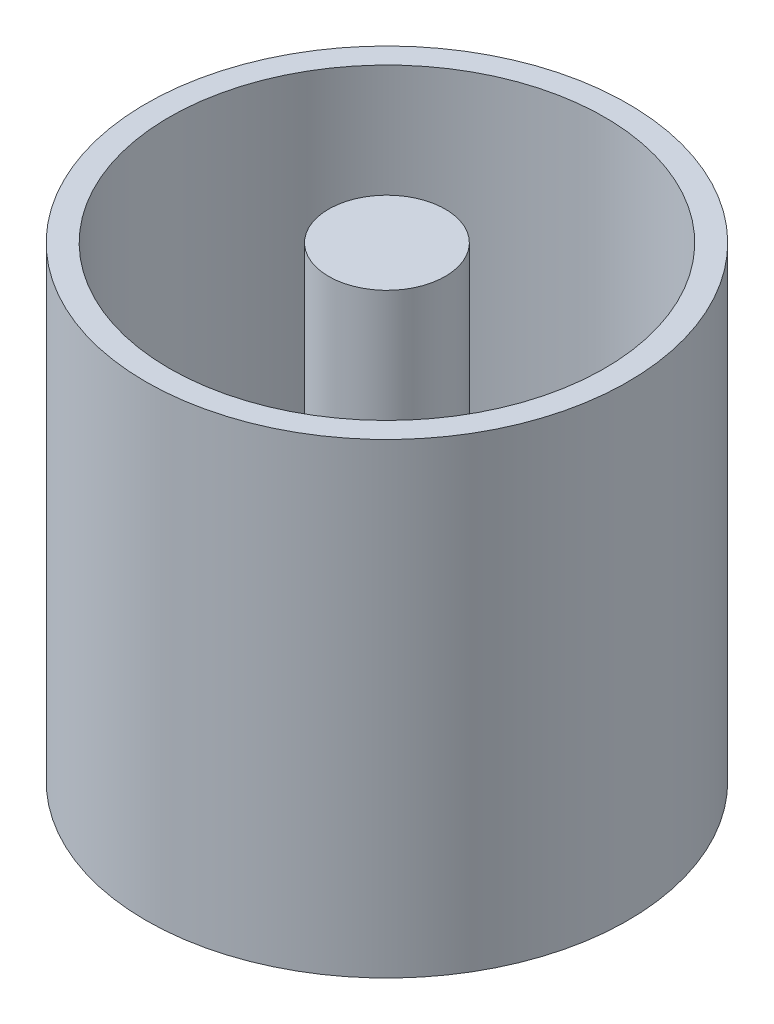
ISO-10303-21;
HEADER;
FILE_DESCRIPTION(('STEP AP214'),'2;1');
FILE_NAME('part.step','',(''),(''),'','','');
FILE_SCHEMA(('AUTOMOTIVE_DESIGN { 1 0 10303 214 1 1 1 1 }'));
ENDSEC;
DATA;
#1=APPLICATION_CONTEXT('core data for automotive mechanical design processes');
#2=APPLICATION_PROTOCOL_DEFINITION('international standard','automotive_design',2000,#1);
#3=PRODUCT_CONTEXT('',#1,'mechanical');
#4=PRODUCT('Part','Part','',(#3));
#5=PRODUCT_RELATED_PRODUCT_CATEGORY('part','',(#4));
#6=PRODUCT_DEFINITION_FORMATION('','',#4);
#7=PRODUCT_DEFINITION_CONTEXT('part definition',#1,'design');
#8=PRODUCT_DEFINITION('design','',#6,#7);
#9=PRODUCT_DEFINITION_SHAPE('','',#8);
#10=(LENGTH_UNIT() NAMED_UNIT(*) SI_UNIT(.MILLI.,.METRE.));
#11=(NAMED_UNIT(*) PLANE_ANGLE_UNIT() SI_UNIT($,.RADIAN.));
#12=(NAMED_UNIT(*) SI_UNIT($,.STERADIAN.) SOLID_ANGLE_UNIT());
#13=UNCERTAINTY_MEASURE_WITH_UNIT(LENGTH_MEASURE(1.E-05),#10,'distance_accuracy_value','');
#14=(GEOMETRIC_REPRESENTATION_CONTEXT(3) GLOBAL_UNCERTAINTY_ASSIGNED_CONTEXT((#13)) GLOBAL_UNIT_ASSIGNED_CONTEXT((#10,
#11,#12)) REPRESENTATION_CONTEXT('',''));
#15=CARTESIAN_POINT('',(0.,0.,0.));
#16=DIRECTION('',(0.,0.,1.));
#17=DIRECTION('',(1.,0.,0.));
#18=AXIS2_PLACEMENT_3D('',#15,#16,#17);
#19=CARTESIAN_POINT('',(0.,30.,0.));
#20=DIRECTION('',(0.,-1.,0.));
#21=DIRECTION('',(0.,0.,-1.));
#22=AXIS2_PLACEMENT_3D('',#19,#20,#21);
#23=CYLINDRICAL_SURFACE('',#22,15.5);
#24=CARTESIAN_POINT('',(0.,30.,0.));
#25=DIRECTION('',(0.,1.,0.));
#26=DIRECTION('',(0.,0.,1.));
#27=AXIS2_PLACEMENT_3D('',#24,#25,#26);
#28=CIRCLE('',#27,15.5);
#29=CARTESIAN_POINT('',(0.,30.,15.5));
#30=VERTEX_POINT('',#29);
#31=EDGE_CURVE('E10',#30,#30,#28,.T.);
#32=ORIENTED_EDGE('',*,*,#31,.F.);
#33=EDGE_LOOP('',(#32));
#34=FACE_BOUND('',#33,.T.);
#35=CARTESIAN_POINT('',(0.,0.,0.));
#36=DIRECTION('',(0.,1.,0.));
#37=DIRECTION('',(0.,0.,1.));
#38=AXIS2_PLACEMENT_3D('',#35,#36,#37);
#39=CIRCLE('',#38,15.5);
#40=CARTESIAN_POINT('',(0.,0.,15.5));
#41=VERTEX_POINT('',#40);
#42=EDGE_CURVE('E46',#41,#41,#39,.T.);
#43=ORIENTED_EDGE('',*,*,#42,.T.);
#44=EDGE_LOOP('',(#43));
#45=FACE_BOUND('',#44,.T.);
#46=ADVANCED_FACE('F39',(#34,#45),#23,.T.);
#47=CARTESIAN_POINT('',(0.,30.,0.));
#48=DIRECTION('',(0.,1.,0.));
#49=DIRECTION('',(0.,0.,1.));
#50=AXIS2_PLACEMENT_3D('',#47,#48,#49);
#51=PLANE('',#50);
#52=CARTESIAN_POINT('',(0.,30.,0.));
#53=DIRECTION('',(0.,1.,0.));
#54=DIRECTION('',(0.,0.,1.));
#55=AXIS2_PLACEMENT_3D('',#52,#53,#54);
#56=CIRCLE('',#55,14.);
#57=CARTESIAN_POINT('',(0.,30.,14.));
#58=VERTEX_POINT('',#57);
#59=EDGE_CURVE('E54',#58,#58,#56,.T.);
#60=ORIENTED_EDGE('',*,*,#59,.F.);
#61=EDGE_LOOP('',(#60));
#62=FACE_BOUND('',#61,.T.);
#63=ORIENTED_EDGE('',*,*,#31,.T.);
#64=EDGE_LOOP('',(#63));
#65=FACE_BOUND('',#64,.T.);
#66=ADVANCED_FACE('F81',(#62,#65),#51,.T.);
#67=CARTESIAN_POINT('',(0.,0.,0.));
#68=DIRECTION('',(0.,1.,0.));
#69=DIRECTION('',(0.,0.,1.));
#70=AXIS2_PLACEMENT_3D('',#67,#68,#69);
#71=PLANE('',#70);
#72=CARTESIAN_POINT('',(-9.,0.,0.));
#73=DIRECTION('',(0.,-1.,0.));
#74=DIRECTION('',(0.,0.,-1.));
#75=AXIS2_PLACEMENT_3D('',#72,#73,#74);
#76=CIRCLE('',#75,1.);
#77=CARTESIAN_POINT('',(-9.,0.,-1.));
#78=VERTEX_POINT('',#77);
#79=EDGE_CURVE('E58',#78,#78,#76,.T.);
#80=ORIENTED_EDGE('',*,*,#79,.F.);
#81=EDGE_LOOP('',(#80));
#82=FACE_BOUND('',#81,.T.);
#83=CARTESIAN_POINT('',(-12.5,0.,0.));
#84=DIRECTION('',(0.,-1.,0.));
#85=DIRECTION('',(0.,0.,-1.));
#86=AXIS2_PLACEMENT_3D('',#83,#84,#85);
#87=CIRCLE('',#86,0.999999999999998);
#88=CARTESIAN_POINT('',(-12.5,0.,-0.999999999999998));
#89=VERTEX_POINT('',#88);
#90=EDGE_CURVE('E63',#89,#89,#87,.T.);
#91=ORIENTED_EDGE('',*,*,#90,.F.);
#92=EDGE_LOOP('',(#91));
#93=FACE_BOUND('',#92,.T.);
#94=ORIENTED_EDGE('',*,*,#42,.F.);
#95=EDGE_LOOP('',(#94));
#96=FACE_BOUND('',#95,.T.);
#97=ADVANCED_FACE('F83',(#82,#93,#96),#71,.F.);
#98=CARTESIAN_POINT('',(0.,3.,0.));
#99=DIRECTION('',(0.,1.,0.));
#100=DIRECTION('',(0.,0.,1.));
#101=AXIS2_PLACEMENT_3D('',#98,#99,#100);
#102=CYLINDRICAL_SURFACE('',#101,14.);
#103=CARTESIAN_POINT('',(0.,3.,0.));
#104=DIRECTION('',(0.,1.,0.));
#105=DIRECTION('',(0.,0.,1.));
#106=AXIS2_PLACEMENT_3D('',#103,#104,#105);
#107=CIRCLE('',#106,14.);
#108=CARTESIAN_POINT('',(0.,3.,14.));
#109=VERTEX_POINT('',#108);
#110=EDGE_CURVE('E51',#109,#109,#107,.T.);
#111=ORIENTED_EDGE('',*,*,#110,.F.);
#112=EDGE_LOOP('',(#111));
#113=FACE_BOUND('',#112,.T.);
#114=ORIENTED_EDGE('',*,*,#59,.T.);
#115=EDGE_LOOP('',(#114));
#116=FACE_BOUND('',#115,.T.);
#117=ADVANCED_FACE('F79',(#113,#116),#102,.F.);
#118=CARTESIAN_POINT('',(0.,3.,0.));
#119=DIRECTION('',(0.,1.,0.));
#120=DIRECTION('',(0.,0.,1.));
#121=AXIS2_PLACEMENT_3D('',#118,#119,#120);
#122=PLANE('',#121);
#123=CARTESIAN_POINT('',(0.,3.,0.));
#124=DIRECTION('',(0.,1.,0.));
#125=DIRECTION('',(0.,0.,1.));
#126=AXIS2_PLACEMENT_3D('',#123,#124,#125);
#127=CIRCLE('',#126,3.75);
#128=CARTESIAN_POINT('',(0.,3.,3.75));
#129=VERTEX_POINT('',#128);
#130=EDGE_CURVE('E71',#129,#129,#127,.T.);
#131=ORIENTED_EDGE('',*,*,#130,.F.);
#132=EDGE_LOOP('',(#131));
#133=FACE_BOUND('',#132,.T.);
#134=CARTESIAN_POINT('',(-9.,3.,0.));
#135=DIRECTION('',(0.,1.,0.));
#136=DIRECTION('',(0.,0.,1.));
#137=AXIS2_PLACEMENT_3D('',#134,#135,#136);
#138=CIRCLE('',#137,1.);
#139=CARTESIAN_POINT('',(-9.,3.,1.));
#140=VERTEX_POINT('',#139);
#141=EDGE_CURVE('E42',#140,#140,#138,.T.);
#142=ORIENTED_EDGE('',*,*,#141,.F.);
#143=EDGE_LOOP('',(#142));
#144=FACE_BOUND('',#143,.T.);
#145=CARTESIAN_POINT('',(-12.5,3.,0.));
#146=DIRECTION('',(0.,1.,0.));
#147=DIRECTION('',(0.,0.,1.));
#148=AXIS2_PLACEMENT_3D('',#145,#146,#147);
#149=CIRCLE('',#148,0.999999999999998);
#150=CARTESIAN_POINT('',(-12.5,3.,0.999999999999998));
#151=VERTEX_POINT('',#150);
#152=EDGE_CURVE('E56',#151,#151,#149,.T.);
#153=ORIENTED_EDGE('',*,*,#152,.F.);
#154=EDGE_LOOP('',(#153));
#155=FACE_BOUND('',#154,.T.);
#156=ORIENTED_EDGE('',*,*,#110,.T.);
#157=EDGE_LOOP('',(#156));
#158=FACE_BOUND('',#157,.T.);
#159=ADVANCED_FACE('F94',(#133,#144,#155,#158),#122,.T.);
#160=CARTESIAN_POINT('',(-12.5,10.,0.));
#161=DIRECTION('',(0.,-1.,0.));
#162=DIRECTION('',(0.,0.,-1.));
#163=AXIS2_PLACEMENT_3D('',#160,#161,#162);
#164=CYLINDRICAL_SURFACE('',#163,0.999999999999998);
#165=ORIENTED_EDGE('',*,*,#152,.T.);
#166=EDGE_LOOP('',(#165));
#167=FACE_BOUND('',#166,.T.);
#168=ORIENTED_EDGE('',*,*,#90,.T.);
#169=EDGE_LOOP('',(#168));
#170=FACE_BOUND('',#169,.T.);
#171=ADVANCED_FACE('F98',(#167,#170),#164,.F.);
#172=CARTESIAN_POINT('',(-9.,10.,0.));
#173=DIRECTION('',(0.,-1.,0.));
#174=DIRECTION('',(0.,0.,-1.));
#175=AXIS2_PLACEMENT_3D('',#172,#173,#174);
#176=CYLINDRICAL_SURFACE('',#175,1.);
#177=ORIENTED_EDGE('',*,*,#141,.T.);
#178=EDGE_LOOP('',(#177));
#179=FACE_BOUND('',#178,.T.);
#180=ORIENTED_EDGE('',*,*,#79,.T.);
#181=EDGE_LOOP('',(#180));
#182=FACE_BOUND('',#181,.T.);
#183=ADVANCED_FACE('F102',(#179,#182),#176,.F.);
#184=CARTESIAN_POINT('',(0.,30.,0.));
#185=DIRECTION('',(0.,-1.,0.));
#186=DIRECTION('',(0.,0.,-1.));
#187=AXIS2_PLACEMENT_3D('',#184,#185,#186);
#188=CYLINDRICAL_SURFACE('',#187,3.75);
#189=CARTESIAN_POINT('',(0.,30.,0.));
#190=DIRECTION('',(0.,1.,0.));
#191=DIRECTION('',(0.,0.,1.));
#192=AXIS2_PLACEMENT_3D('',#189,#190,#191);
#193=CIRCLE('',#192,3.75);
#194=CARTESIAN_POINT('',(0.,30.,3.75));
#195=VERTEX_POINT('',#194);
#196=EDGE_CURVE('E68',#195,#195,#193,.T.);
#197=ORIENTED_EDGE('',*,*,#196,.F.);
#198=EDGE_LOOP('',(#197));
#199=FACE_BOUND('',#198,.T.);
#200=ORIENTED_EDGE('',*,*,#130,.T.);
#201=EDGE_LOOP('',(#200));
#202=FACE_BOUND('',#201,.T.);
#203=ADVANCED_FACE('F105',(#199,#202),#188,.T.);
#204=CARTESIAN_POINT('',(0.,30.,0.));
#205=DIRECTION('',(0.,1.,0.));
#206=DIRECTION('',(0.,0.,1.));
#207=AXIS2_PLACEMENT_3D('',#204,#205,#206);
#208=PLANE('',#207);
#209=ORIENTED_EDGE('',*,*,#196,.T.);
#210=EDGE_LOOP('',(#209));
#211=FACE_BOUND('',#210,.T.);
#212=ADVANCED_FACE('F109',(#211),#208,.T.);
#213=CLOSED_SHELL('',(#46,#66,#97,#117,#159,#171,#183,#203,#212));
#214=MANIFOLD_SOLID_BREP('B2',#213);
#215=ADVANCED_BREP_SHAPE_REPRESENTATION('',(#18,#214),#14);
#216=SHAPE_DEFINITION_REPRESENTATION(#9,#215);
ENDSEC;
END-ISO-10303-21;
